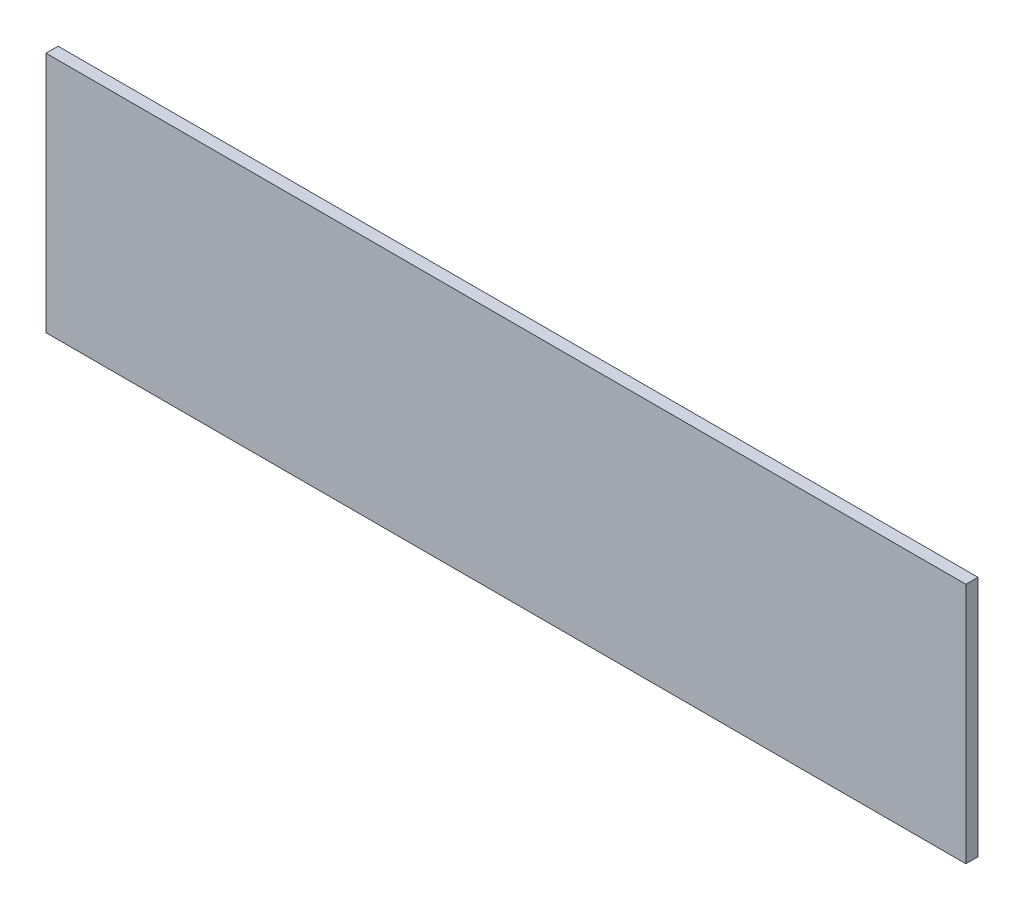
ISO-10303-21;
HEADER;
FILE_DESCRIPTION(('STEP AP214'),'2;1');
FILE_NAME('part.step','',(''),(''),'','','');
FILE_SCHEMA(('AUTOMOTIVE_DESIGN { 1 0 10303 214 1 1 1 1 }'));
ENDSEC;
DATA;
#1=APPLICATION_CONTEXT('core data for automotive mechanical design processes');
#2=APPLICATION_PROTOCOL_DEFINITION('international standard','automotive_design',2000,#1);
#3=PRODUCT_CONTEXT('',#1,'mechanical');
#4=PRODUCT('Part','Part','',(#3));
#5=PRODUCT_RELATED_PRODUCT_CATEGORY('part','',(#4));
#6=PRODUCT_DEFINITION_FORMATION('','',#4);
#7=PRODUCT_DEFINITION_CONTEXT('part definition',#1,'design');
#8=PRODUCT_DEFINITION('design','',#6,#7);
#9=PRODUCT_DEFINITION_SHAPE('','',#8);
#10=(LENGTH_UNIT() NAMED_UNIT(*) SI_UNIT(.MILLI.,.METRE.));
#11=(NAMED_UNIT(*) PLANE_ANGLE_UNIT() SI_UNIT($,.RADIAN.));
#12=(NAMED_UNIT(*) SI_UNIT($,.STERADIAN.) SOLID_ANGLE_UNIT());
#13=UNCERTAINTY_MEASURE_WITH_UNIT(LENGTH_MEASURE(1.E-05),#10,'distance_accuracy_value','');
#14=(GEOMETRIC_REPRESENTATION_CONTEXT(3) GLOBAL_UNCERTAINTY_ASSIGNED_CONTEXT((#13)) GLOBAL_UNIT_ASSIGNED_CONTEXT((#10,
#11,#12)) REPRESENTATION_CONTEXT('',''));
#15=CARTESIAN_POINT('',(0.,0.,0.));
#16=DIRECTION('',(0.,0.,1.));
#17=DIRECTION('',(1.,0.,0.));
#18=AXIS2_PLACEMENT_3D('',#15,#16,#17);
#19=CARTESIAN_POINT('',(-139.445658057532,100.719339622642,5.));
#20=DIRECTION('',(1.,0.,0.));
#21=DIRECTION('',(0.,1.,0.));
#22=AXIS2_PLACEMENT_3D('',#19,#20,#21);
#23=PLANE('',#22);
#24=DIRECTION('',(0.,-1.,0.));
#25=VECTOR('',#24,1.);
#26=CARTESIAN_POINT('',(-139.445658057532,100.719339622642,0.));
#27=LINE('',#26,#25);
#28=CARTESIAN_POINT('',(-139.445658057532,100.719339622642,0.));
#29=VERTEX_POINT('',#28);
#30=CARTESIAN_POINT('',(-139.445658057532,0.719339622641563,0.));
#31=VERTEX_POINT('',#30);
#32=EDGE_CURVE('E96',#29,#31,#27,.T.);
#33=ORIENTED_EDGE('',*,*,#32,.T.);
#34=DIRECTION('',(0.,0.,-1.));
#35=VECTOR('',#34,1.);
#36=CARTESIAN_POINT('',(-139.445658057532,0.719339622641563,5.));
#37=LINE('',#36,#35);
#38=CARTESIAN_POINT('',(-139.445658057532,0.719339622641563,5.));
#39=VERTEX_POINT('',#38);
#40=EDGE_CURVE('E11',#39,#31,#37,.T.);
#41=ORIENTED_EDGE('',*,*,#40,.F.);
#42=DIRECTION('',(0.,-1.,0.));
#43=VECTOR('',#42,1.);
#44=CARTESIAN_POINT('',(-139.445658057532,100.719339622642,5.));
#45=LINE('',#44,#43);
#46=CARTESIAN_POINT('',(-139.445658057532,100.719339622642,5.));
#47=VERTEX_POINT('',#46);
#48=EDGE_CURVE('E84',#47,#39,#45,.T.);
#49=ORIENTED_EDGE('',*,*,#48,.F.);
#50=DIRECTION('',(0.,0.,-1.));
#51=VECTOR('',#50,1.);
#52=CARTESIAN_POINT('',(-139.445658057532,100.719339622642,5.));
#53=LINE('',#52,#51);
#54=EDGE_CURVE('E92',#47,#29,#53,.T.);
#55=ORIENTED_EDGE('',*,*,#54,.T.);
#56=EDGE_LOOP('',(#33,#41,#49,#55));
#57=FACE_BOUND('',#56,.T.);
#58=ADVANCED_FACE('F33',(#57),#23,.F.);
#59=CARTESIAN_POINT('',(-139.445658057532,0.719339622641563,5.));
#60=DIRECTION('',(0.,1.,0.));
#61=DIRECTION('',(0.,0.,1.));
#62=AXIS2_PLACEMENT_3D('',#59,#60,#61);
#63=PLANE('',#62);
#64=DIRECTION('',(1.,0.,0.));
#65=VECTOR('',#64,1.);
#66=CARTESIAN_POINT('',(-139.445658057532,0.719339622641563,0.));
#67=LINE('',#66,#65);
#68=CARTESIAN_POINT('',(240.554341942468,0.719339622641563,0.));
#69=VERTEX_POINT('',#68);
#70=EDGE_CURVE('E88',#31,#69,#67,.T.);
#71=ORIENTED_EDGE('',*,*,#70,.T.);
#72=DIRECTION('',(0.,0.,-1.));
#73=VECTOR('',#72,1.);
#74=CARTESIAN_POINT('',(240.554341942468,0.719339622641563,5.));
#75=LINE('',#74,#73);
#76=CARTESIAN_POINT('',(240.554341942468,0.719339622641563,5.));
#77=VERTEX_POINT('',#76);
#78=EDGE_CURVE('E41',#77,#69,#75,.T.);
#79=ORIENTED_EDGE('',*,*,#78,.F.);
#80=DIRECTION('',(1.,0.,0.));
#81=VECTOR('',#80,1.);
#82=CARTESIAN_POINT('',(-139.445658057532,0.719339622641563,5.));
#83=LINE('',#82,#81);
#84=EDGE_CURVE('E79',#39,#77,#83,.T.);
#85=ORIENTED_EDGE('',*,*,#84,.F.);
#86=ORIENTED_EDGE('',*,*,#40,.T.);
#87=EDGE_LOOP('',(#71,#79,#85,#86));
#88=FACE_BOUND('',#87,.T.);
#89=ADVANCED_FACE('F87',(#88),#63,.F.);
#90=CARTESIAN_POINT('',(240.554341942468,100.719339622642,5.));
#91=DIRECTION('',(-1.,0.,0.));
#92=DIRECTION('',(0.,-1.,0.));
#93=AXIS2_PLACEMENT_3D('',#90,#91,#92);
#94=PLANE('',#93);
#95=DIRECTION('',(0.,1.,0.));
#96=VECTOR('',#95,1.);
#97=CARTESIAN_POINT('',(240.554341942468,100.719339622642,0.));
#98=LINE('',#97,#96);
#99=CARTESIAN_POINT('',(240.554341942468,100.719339622642,0.));
#100=VERTEX_POINT('',#99);
#101=EDGE_CURVE('E66',#69,#100,#98,.T.);
#102=ORIENTED_EDGE('',*,*,#101,.T.);
#103=DIRECTION('',(0.,0.,-1.));
#104=VECTOR('',#103,1.);
#105=CARTESIAN_POINT('',(240.554341942468,100.719339622642,5.));
#106=LINE('',#105,#104);
#107=CARTESIAN_POINT('',(240.554341942468,100.719339622642,5.));
#108=VERTEX_POINT('',#107);
#109=EDGE_CURVE('E89',#108,#100,#106,.T.);
#110=ORIENTED_EDGE('',*,*,#109,.F.);
#111=DIRECTION('',(0.,1.,0.));
#112=VECTOR('',#111,1.);
#113=CARTESIAN_POINT('',(240.554341942468,100.719339622642,5.));
#114=LINE('',#113,#112);
#115=EDGE_CURVE('E82',#77,#108,#114,.T.);
#116=ORIENTED_EDGE('',*,*,#115,.F.);
#117=ORIENTED_EDGE('',*,*,#78,.T.);
#118=EDGE_LOOP('',(#102,#110,#116,#117));
#119=FACE_BOUND('',#118,.T.);
#120=ADVANCED_FACE('F90',(#119),#94,.F.);
#121=CARTESIAN_POINT('',(-139.445658057532,100.719339622642,5.));
#122=DIRECTION('',(0.,-1.,0.));
#123=DIRECTION('',(0.,0.,-1.));
#124=AXIS2_PLACEMENT_3D('',#121,#122,#123);
#125=PLANE('',#124);
#126=DIRECTION('',(-1.,0.,0.));
#127=VECTOR('',#126,1.);
#128=CARTESIAN_POINT('',(-139.445658057532,100.719339622642,0.));
#129=LINE('',#128,#127);
#130=EDGE_CURVE('E72',#100,#29,#129,.T.);
#131=ORIENTED_EDGE('',*,*,#130,.T.);
#132=ORIENTED_EDGE('',*,*,#54,.F.);
#133=DIRECTION('',(-1.,0.,0.));
#134=VECTOR('',#133,1.);
#135=CARTESIAN_POINT('',(-139.445658057532,100.719339622642,5.));
#136=LINE('',#135,#134);
#137=EDGE_CURVE('E49',#108,#47,#136,.T.);
#138=ORIENTED_EDGE('',*,*,#137,.F.);
#139=ORIENTED_EDGE('',*,*,#109,.T.);
#140=EDGE_LOOP('',(#131,#132,#138,#139));
#141=FACE_BOUND('',#140,.T.);
#142=ADVANCED_FACE('F103',(#141),#125,.F.);
#143=CARTESIAN_POINT('',(0.,0.,5.));
#144=DIRECTION('',(0.,0.,1.));
#145=DIRECTION('',(1.,0.,0.));
#146=AXIS2_PLACEMENT_3D('',#143,#144,#145);
#147=PLANE('',#146);
#148=ORIENTED_EDGE('',*,*,#48,.T.);
#149=ORIENTED_EDGE('',*,*,#84,.T.);
#150=ORIENTED_EDGE('',*,*,#115,.T.);
#151=ORIENTED_EDGE('',*,*,#137,.T.);
#152=EDGE_LOOP('',(#148,#149,#150,#151));
#153=FACE_BOUND('',#152,.T.);
#154=ADVANCED_FACE('F80',(#153),#147,.T.);
#155=CARTESIAN_POINT('',(0.,0.,0.));
#156=DIRECTION('',(0.,0.,1.));
#157=DIRECTION('',(1.,0.,0.));
#158=AXIS2_PLACEMENT_3D('',#155,#156,#157);
#159=PLANE('',#158);
#160=ORIENTED_EDGE('',*,*,#32,.F.);
#161=ORIENTED_EDGE('',*,*,#130,.F.);
#162=ORIENTED_EDGE('',*,*,#101,.F.);
#163=ORIENTED_EDGE('',*,*,#70,.F.);
#164=EDGE_LOOP('',(#160,#161,#162,#163));
#165=FACE_BOUND('',#164,.T.);
#166=ADVANCED_FACE('F106',(#165),#159,.F.);
#167=CLOSED_SHELL('',(#58,#89,#120,#142,#154,#166));
#168=MANIFOLD_SOLID_BREP('B2',#167);
#169=ADVANCED_BREP_SHAPE_REPRESENTATION('',(#18,#168),#14);
#170=SHAPE_DEFINITION_REPRESENTATION(#9,#169);
ENDSEC;
END-ISO-10303-21;
